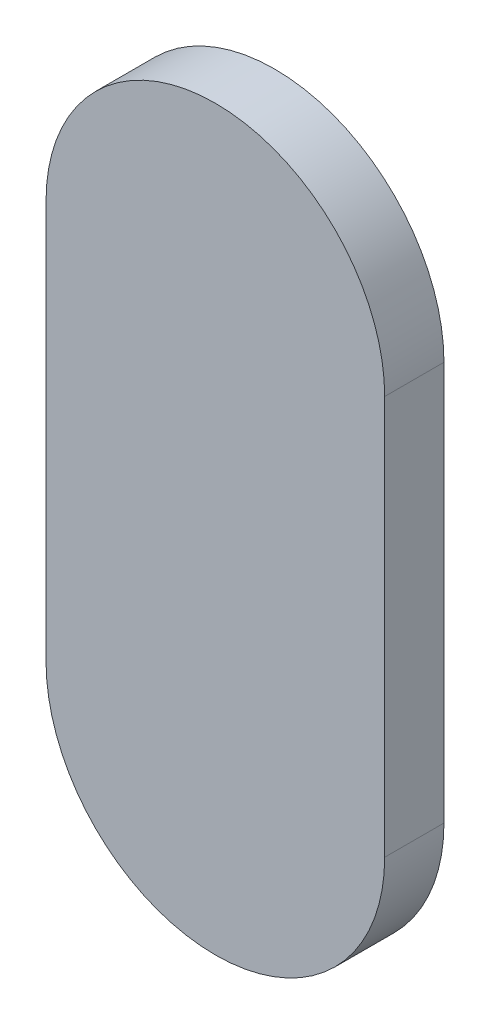
ISO-10303-21;
HEADER;
FILE_DESCRIPTION(('STEP AP214'),'2;1');
FILE_NAME('part.step','',(''),(''),'','','');
FILE_SCHEMA(('AUTOMOTIVE_DESIGN { 1 0 10303 214 1 1 1 1 }'));
ENDSEC;
DATA;
#1=APPLICATION_CONTEXT('core data for automotive mechanical design processes');
#2=APPLICATION_PROTOCOL_DEFINITION('international standard','automotive_design',2000,#1);
#3=PRODUCT_CONTEXT('',#1,'mechanical');
#4=PRODUCT('Part','Part','',(#3));
#5=PRODUCT_RELATED_PRODUCT_CATEGORY('part','',(#4));
#6=PRODUCT_DEFINITION_FORMATION('','',#4);
#7=PRODUCT_DEFINITION_CONTEXT('part definition',#1,'design');
#8=PRODUCT_DEFINITION('design','',#6,#7);
#9=PRODUCT_DEFINITION_SHAPE('','',#8);
#10=(LENGTH_UNIT() NAMED_UNIT(*) SI_UNIT(.MILLI.,.METRE.));
#11=(NAMED_UNIT(*) PLANE_ANGLE_UNIT() SI_UNIT($,.RADIAN.));
#12=(NAMED_UNIT(*) SI_UNIT($,.STERADIAN.) SOLID_ANGLE_UNIT());
#13=UNCERTAINTY_MEASURE_WITH_UNIT(LENGTH_MEASURE(1.E-05),#10,'distance_accuracy_value','');
#14=(GEOMETRIC_REPRESENTATION_CONTEXT(3) GLOBAL_UNCERTAINTY_ASSIGNED_CONTEXT((#13)) GLOBAL_UNIT_ASSIGNED_CONTEXT((#10,
#11,#12)) REPRESENTATION_CONTEXT('',''));
#15=CARTESIAN_POINT('',(0.,0.,0.));
#16=DIRECTION('',(0.,0.,1.));
#17=DIRECTION('',(1.,0.,0.));
#18=AXIS2_PLACEMENT_3D('',#15,#16,#17);
#19=CARTESIAN_POINT('',(88.5,-124.225,1.635));
#20=DIRECTION('',(0.,0.,1.));
#21=DIRECTION('',(1.,0.,0.));
#22=AXIS2_PLACEMENT_3D('',#19,#20,#21);
#23=PLANE('',#22);
#24=DIRECTION('',(0.,-1.,0.));
#25=VECTOR('',#24,1.);
#26=CARTESIAN_POINT('',(88.5,-124.225,1.635));
#27=LINE('',#26,#25);
#28=CARTESIAN_POINT('',(88.5,-124.225,1.635));
#29=VERTEX_POINT('',#28);
#30=CARTESIAN_POINT('',(88.5,-124.46066,1.635));
#31=VERTEX_POINT('',#30);
#32=EDGE_CURVE('E84',#29,#31,#27,.T.);
#33=ORIENTED_EDGE('',*,*,#32,.T.);
#34=CARTESIAN_POINT('',(88.6,-124.46066,1.635));
#35=DIRECTION('',(0.,0.,1.));
#36=DIRECTION('',(-1.,-1.42108547152E-13,0.));
#37=AXIS2_PLACEMENT_3D('',#34,#35,#36);
#38=CIRCLE('',#37,0.1);
#39=CARTESIAN_POINT('',(88.7,-124.46066,1.635));
#40=VERTEX_POINT('',#39);
#41=EDGE_CURVE('E70',#31,#40,#38,.T.);
#42=ORIENTED_EDGE('',*,*,#41,.T.);
#43=DIRECTION('',(0.,1.,0.));
#44=VECTOR('',#43,1.);
#45=CARTESIAN_POINT('',(88.7,-124.46066,1.635));
#46=LINE('',#45,#44);
#47=CARTESIAN_POINT('',(88.7,-124.225,1.635));
#48=VERTEX_POINT('',#47);
#49=EDGE_CURVE('E108',#40,#48,#46,.T.);
#50=ORIENTED_EDGE('',*,*,#49,.T.);
#51=CARTESIAN_POINT('',(88.6,-124.225,1.635));
#52=DIRECTION('',(0.,0.,1.));
#53=DIRECTION('',(1.,1.42108547152E-13,0.));
#54=AXIS2_PLACEMENT_3D('',#51,#52,#53);
#55=CIRCLE('',#54,0.1);
#56=EDGE_CURVE('E11',#48,#29,#55,.T.);
#57=ORIENTED_EDGE('',*,*,#56,.T.);
#58=EDGE_LOOP('',(#33,#42,#50,#57));
#59=FACE_BOUND('',#58,.T.);
#60=ADVANCED_FACE('F17',(#59),#23,.T.);
#61=CARTESIAN_POINT('',(88.5,-124.225,1.6));
#62=DIRECTION('',(0.,0.,1.));
#63=DIRECTION('',(1.,0.,0.));
#64=AXIS2_PLACEMENT_3D('',#61,#62,#63);
#65=PLANE('',#64);
#66=CARTESIAN_POINT('',(88.6,-124.225,1.6));
#67=DIRECTION('',(0.,0.,1.));
#68=DIRECTION('',(1.,1.42108547152E-13,0.));
#69=AXIS2_PLACEMENT_3D('',#66,#67,#68);
#70=CIRCLE('',#69,0.1);
#71=CARTESIAN_POINT('',(88.7,-124.225,1.6));
#72=VERTEX_POINT('',#71);
#73=CARTESIAN_POINT('',(88.5,-124.225,1.6));
#74=VERTEX_POINT('',#73);
#75=EDGE_CURVE('E25',#72,#74,#70,.T.);
#76=ORIENTED_EDGE('',*,*,#75,.F.);
#77=DIRECTION('',(0.,1.,0.));
#78=VECTOR('',#77,1.);
#79=CARTESIAN_POINT('',(88.7,-124.46066,1.6));
#80=LINE('',#79,#78);
#81=CARTESIAN_POINT('',(88.7,-124.46066,1.6));
#82=VERTEX_POINT('',#81);
#83=EDGE_CURVE('E81',#82,#72,#80,.T.);
#84=ORIENTED_EDGE('',*,*,#83,.F.);
#85=CARTESIAN_POINT('',(88.6,-124.46066,1.6));
#86=DIRECTION('',(0.,0.,1.));
#87=DIRECTION('',(-1.,-1.42108547152E-13,0.));
#88=AXIS2_PLACEMENT_3D('',#85,#86,#87);
#89=CIRCLE('',#88,0.1);
#90=CARTESIAN_POINT('',(88.5,-124.46066,1.6));
#91=VERTEX_POINT('',#90);
#92=EDGE_CURVE('E102',#91,#82,#89,.T.);
#93=ORIENTED_EDGE('',*,*,#92,.F.);
#94=DIRECTION('',(0.,-1.,0.));
#95=VECTOR('',#94,1.);
#96=CARTESIAN_POINT('',(88.5,-124.225,1.6));
#97=LINE('',#96,#95);
#98=EDGE_CURVE('E91',#74,#91,#97,.T.);
#99=ORIENTED_EDGE('',*,*,#98,.F.);
#100=EDGE_LOOP('',(#76,#84,#93,#99));
#101=FACE_BOUND('',#100,.T.);
#102=ADVANCED_FACE('F122',(#101),#65,.F.);
#103=CARTESIAN_POINT('',(88.6,-124.225,1.6));
#104=DIRECTION('',(0.,0.,-1.));
#105=DIRECTION('',(1.,1.42108547152E-13,0.));
#106=AXIS2_PLACEMENT_3D('',#103,#104,#105);
#107=CYLINDRICAL_SURFACE('',#106,0.1);
#108=ORIENTED_EDGE('',*,*,#75,.T.);
#109=DIRECTION('',(0.,0.,1.));
#110=VECTOR('',#109,1.);
#111=CARTESIAN_POINT('',(88.5,-124.225,1.6));
#112=LINE('',#111,#110);
#113=EDGE_CURVE('E88',#74,#29,#112,.T.);
#114=ORIENTED_EDGE('',*,*,#113,.T.);
#115=ORIENTED_EDGE('',*,*,#56,.F.);
#116=DIRECTION('',(0.,0.,1.));
#117=VECTOR('',#116,1.);
#118=CARTESIAN_POINT('',(88.7,-124.225,1.6));
#119=LINE('',#118,#117);
#120=EDGE_CURVE('E104',#72,#48,#119,.T.);
#121=ORIENTED_EDGE('',*,*,#120,.F.);
#122=EDGE_LOOP('',(#108,#114,#115,#121));
#123=FACE_BOUND('',#122,.T.);
#124=ADVANCED_FACE('F121',(#123),#107,.T.);
#125=CARTESIAN_POINT('',(88.7,-124.46066,1.6));
#126=DIRECTION('',(-1.,0.,0.));
#127=DIRECTION('',(0.,0.,1.));
#128=AXIS2_PLACEMENT_3D('',#125,#126,#127);
#129=PLANE('',#128);
#130=ORIENTED_EDGE('',*,*,#83,.T.);
#131=ORIENTED_EDGE('',*,*,#120,.T.);
#132=ORIENTED_EDGE('',*,*,#49,.F.);
#133=DIRECTION('',(0.,0.,1.));
#134=VECTOR('',#133,1.);
#135=CARTESIAN_POINT('',(88.7,-124.46066,1.6));
#136=LINE('',#135,#134);
#137=EDGE_CURVE('E78',#82,#40,#136,.T.);
#138=ORIENTED_EDGE('',*,*,#137,.F.);
#139=EDGE_LOOP('',(#130,#131,#132,#138));
#140=FACE_BOUND('',#139,.T.);
#141=ADVANCED_FACE('F124',(#140),#129,.F.);
#142=CARTESIAN_POINT('',(88.6,-124.46066,1.6));
#143=DIRECTION('',(0.,0.,-1.));
#144=DIRECTION('',(-1.,-1.42108547152E-13,0.));
#145=AXIS2_PLACEMENT_3D('',#142,#143,#144);
#146=CYLINDRICAL_SURFACE('',#145,0.1);
#147=ORIENTED_EDGE('',*,*,#92,.T.);
#148=ORIENTED_EDGE('',*,*,#137,.T.);
#149=ORIENTED_EDGE('',*,*,#41,.F.);
#150=DIRECTION('',(0.,0.,1.));
#151=VECTOR('',#150,1.);
#152=CARTESIAN_POINT('',(88.5,-124.46066,1.6));
#153=LINE('',#152,#151);
#154=EDGE_CURVE('E75',#91,#31,#153,.T.);
#155=ORIENTED_EDGE('',*,*,#154,.F.);
#156=EDGE_LOOP('',(#147,#148,#149,#155));
#157=FACE_BOUND('',#156,.T.);
#158=ADVANCED_FACE('F73',(#157),#146,.T.);
#159=CARTESIAN_POINT('',(88.5,-124.225,1.6));
#160=DIRECTION('',(1.,0.,0.));
#161=DIRECTION('',(0.,1.,0.));
#162=AXIS2_PLACEMENT_3D('',#159,#160,#161);
#163=PLANE('',#162);
#164=ORIENTED_EDGE('',*,*,#98,.T.);
#165=ORIENTED_EDGE('',*,*,#154,.T.);
#166=ORIENTED_EDGE('',*,*,#32,.F.);
#167=ORIENTED_EDGE('',*,*,#113,.F.);
#168=EDGE_LOOP('',(#164,#165,#166,#167));
#169=FACE_BOUND('',#168,.T.);
#170=ADVANCED_FACE('F90',(#169),#163,.F.);
#171=CLOSED_SHELL('',(#60,#102,#124,#141,#158,#170));
#172=MANIFOLD_SOLID_BREP('B1',#171);
#173=ADVANCED_BREP_SHAPE_REPRESENTATION('',(#18,#172),#14);
#174=SHAPE_DEFINITION_REPRESENTATION(#9,#173);
ENDSEC;
END-ISO-10303-21;
